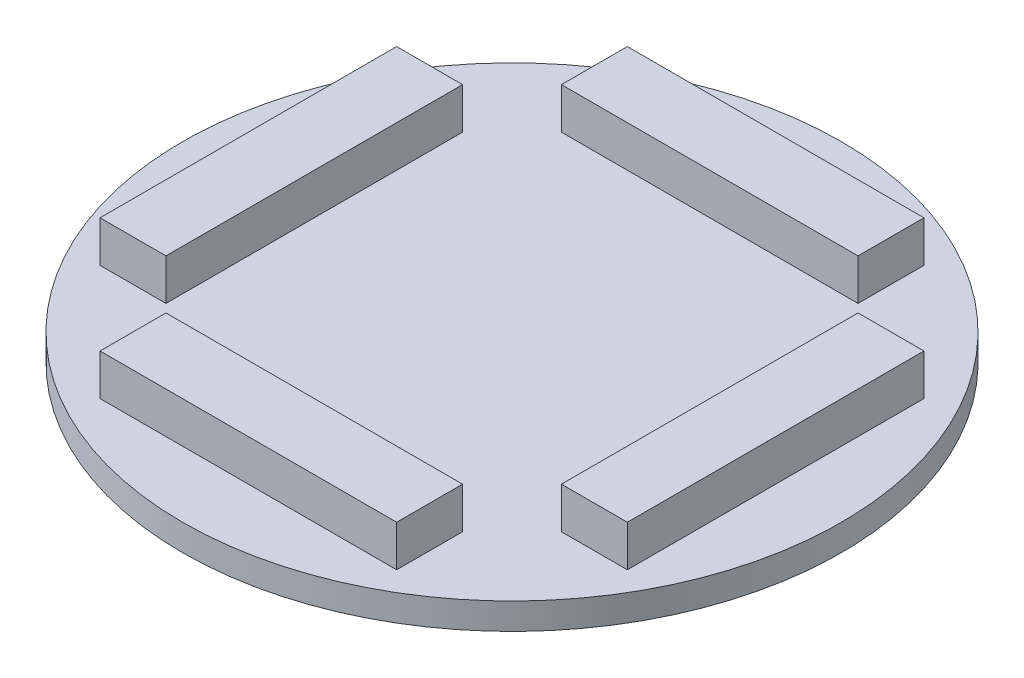
ISO-10303-21;
HEADER;
FILE_DESCRIPTION(('STEP AP214'),'2;1');
FILE_NAME('part.step','',(''),(''),'','','');
FILE_SCHEMA(('AUTOMOTIVE_DESIGN { 1 0 10303 214 1 1 1 1 }'));
ENDSEC;
DATA;
#1=APPLICATION_CONTEXT('core data for automotive mechanical design processes');
#2=APPLICATION_PROTOCOL_DEFINITION('international standard','automotive_design',2000,#1);
#3=PRODUCT_CONTEXT('',#1,'mechanical');
#4=PRODUCT('Part','Part','',(#3));
#5=PRODUCT_RELATED_PRODUCT_CATEGORY('part','',(#4));
#6=PRODUCT_DEFINITION_FORMATION('','',#4);
#7=PRODUCT_DEFINITION_CONTEXT('part definition',#1,'design');
#8=PRODUCT_DEFINITION('design','',#6,#7);
#9=PRODUCT_DEFINITION_SHAPE('','',#8);
#10=(LENGTH_UNIT() NAMED_UNIT(*) SI_UNIT(.MILLI.,.METRE.));
#11=(NAMED_UNIT(*) PLANE_ANGLE_UNIT() SI_UNIT($,.RADIAN.));
#12=(NAMED_UNIT(*) SI_UNIT($,.STERADIAN.) SOLID_ANGLE_UNIT());
#13=UNCERTAINTY_MEASURE_WITH_UNIT(LENGTH_MEASURE(1.E-05),#10,'distance_accuracy_value','');
#14=(GEOMETRIC_REPRESENTATION_CONTEXT(3) GLOBAL_UNCERTAINTY_ASSIGNED_CONTEXT((#13)) GLOBAL_UNIT_ASSIGNED_CONTEXT((#10,
#11,#12)) REPRESENTATION_CONTEXT('',''));
#15=CARTESIAN_POINT('',(0.,0.,0.));
#16=DIRECTION('',(0.,0.,1.));
#17=DIRECTION('',(1.,0.,0.));
#18=AXIS2_PLACEMENT_3D('',#15,#16,#17);
#19=CARTESIAN_POINT('',(0.,1.6,0.));
#20=DIRECTION('',(0.,1.,0.));
#21=DIRECTION('',(0.,0.,1.));
#22=AXIS2_PLACEMENT_3D('',#19,#20,#21);
#23=PLANE('',#22);
#24=CARTESIAN_POINT('',(0.,1.6,0.));
#25=DIRECTION('',(0.,1.,0.));
#26=DIRECTION('',(0.,0.,1.));
#27=AXIS2_PLACEMENT_3D('',#24,#25,#26);
#28=CIRCLE('',#27,20.);
#29=CARTESIAN_POINT('',(0.,1.6,20.));
#30=VERTEX_POINT('',#29);
#31=EDGE_CURVE('E11',#30,#30,#28,.T.);
#32=ORIENTED_EDGE('',*,*,#31,.T.);
#33=EDGE_LOOP('',(#32));
#34=FACE_BOUND('',#33,.T.);
#35=DIRECTION('',(1.,0.,0.));
#36=VECTOR('',#35,1.);
#37=CARTESIAN_POINT('',(-9.,1.6,-12.));
#38=LINE('',#37,#36);
#39=CARTESIAN_POINT('',(-9.,1.6,-12.));
#40=VERTEX_POINT('',#39);
#41=CARTESIAN_POINT('',(9.,1.6,-12.));
#42=VERTEX_POINT('',#41);
#43=EDGE_CURVE('E257',#40,#42,#38,.T.);
#44=ORIENTED_EDGE('',*,*,#43,.F.);
#45=DIRECTION('',(0.,0.,1.));
#46=VECTOR('',#45,1.);
#47=CARTESIAN_POINT('',(-9.,1.6,-16.));
#48=LINE('',#47,#46);
#49=CARTESIAN_POINT('',(-9.,1.6,-16.));
#50=VERTEX_POINT('',#49);
#51=EDGE_CURVE('E241',#50,#40,#48,.T.);
#52=ORIENTED_EDGE('',*,*,#51,.F.);
#53=DIRECTION('',(1.,0.,0.));
#54=VECTOR('',#53,1.);
#55=CARTESIAN_POINT('',(-9.,1.6,-16.));
#56=LINE('',#55,#54);
#57=CARTESIAN_POINT('',(9.,1.6,-16.));
#58=VERTEX_POINT('',#57);
#59=EDGE_CURVE('E246',#50,#58,#56,.T.);
#60=ORIENTED_EDGE('',*,*,#59,.T.);
#61=DIRECTION('',(0.,0.,1.));
#62=VECTOR('',#61,1.);
#63=CARTESIAN_POINT('',(9.,1.6,-16.));
#64=LINE('',#63,#62);
#65=EDGE_CURVE('E260',#58,#42,#64,.T.);
#66=ORIENTED_EDGE('',*,*,#65,.T.);
#67=EDGE_LOOP('',(#44,#52,#60,#66));
#68=FACE_BOUND('',#67,.T.);
#69=DIRECTION('',(0.,0.,-1.));
#70=VECTOR('',#69,1.);
#71=CARTESIAN_POINT('',(-12.,1.6,9.00000000000004));
#72=LINE('',#71,#70);
#73=CARTESIAN_POINT('',(-12.,1.6,9.00000000000004));
#74=VERTEX_POINT('',#73);
#75=CARTESIAN_POINT('',(-12.,1.6,-8.99999999999996));
#76=VERTEX_POINT('',#75);
#77=EDGE_CURVE('E224',#74,#76,#72,.T.);
#78=ORIENTED_EDGE('',*,*,#77,.F.);
#79=DIRECTION('',(1.,0.,0.));
#80=VECTOR('',#79,1.);
#81=CARTESIAN_POINT('',(-16.,1.6,9.00000000000006));
#82=LINE('',#81,#80);
#83=CARTESIAN_POINT('',(-16.,1.6,9.00000000000006));
#84=VERTEX_POINT('',#83);
#85=EDGE_CURVE('E208',#84,#74,#82,.T.);
#86=ORIENTED_EDGE('',*,*,#85,.F.);
#87=DIRECTION('',(0.,0.,-1.));
#88=VECTOR('',#87,1.);
#89=CARTESIAN_POINT('',(-16.,1.6,9.00000000000006));
#90=LINE('',#89,#88);
#91=CARTESIAN_POINT('',(-16.,1.6,-8.99999999999994));
#92=VERTEX_POINT('',#91);
#93=EDGE_CURVE('E213',#84,#92,#90,.T.);
#94=ORIENTED_EDGE('',*,*,#93,.T.);
#95=DIRECTION('',(1.,0.,0.));
#96=VECTOR('',#95,1.);
#97=CARTESIAN_POINT('',(-16.,1.6,-8.99999999999994));
#98=LINE('',#97,#96);
#99=EDGE_CURVE('E227',#92,#76,#98,.T.);
#100=ORIENTED_EDGE('',*,*,#99,.T.);
#101=EDGE_LOOP('',(#78,#86,#94,#100));
#102=FACE_BOUND('',#101,.T.);
#103=DIRECTION('',(-1.,0.,0.));
#104=VECTOR('',#103,1.);
#105=CARTESIAN_POINT('',(9.,1.6,12.));
#106=LINE('',#105,#104);
#107=CARTESIAN_POINT('',(9.,1.6,12.));
#108=VERTEX_POINT('',#107);
#109=CARTESIAN_POINT('',(-9.,1.6,12.));
#110=VERTEX_POINT('',#109);
#111=EDGE_CURVE('E173',#108,#110,#106,.T.);
#112=ORIENTED_EDGE('',*,*,#111,.F.);
#113=DIRECTION('',(0.,0.,-1.));
#114=VECTOR('',#113,1.);
#115=CARTESIAN_POINT('',(9.,1.6,16.));
#116=LINE('',#115,#114);
#117=CARTESIAN_POINT('',(9.,1.6,16.));
#118=VERTEX_POINT('',#117);
#119=EDGE_CURVE('E170',#118,#108,#116,.T.);
#120=ORIENTED_EDGE('',*,*,#119,.F.);
#121=DIRECTION('',(-1.,0.,0.));
#122=VECTOR('',#121,1.);
#123=CARTESIAN_POINT('',(9.,1.6,16.));
#124=LINE('',#123,#122);
#125=CARTESIAN_POINT('',(-9.,1.6,16.));
#126=VERTEX_POINT('',#125);
#127=EDGE_CURVE('E183',#118,#126,#124,.T.);
#128=ORIENTED_EDGE('',*,*,#127,.T.);
#129=DIRECTION('',(0.,0.,-1.));
#130=VECTOR('',#129,1.);
#131=CARTESIAN_POINT('',(-9.,1.6,16.));
#132=LINE('',#131,#130);
#133=EDGE_CURVE('E194',#126,#110,#132,.T.);
#134=ORIENTED_EDGE('',*,*,#133,.T.);
#135=EDGE_LOOP('',(#112,#120,#128,#134));
#136=FACE_BOUND('',#135,.T.);
#137=DIRECTION('',(0.,0.,1.));
#138=VECTOR('',#137,1.);
#139=CARTESIAN_POINT('',(11.9999999999999,1.6,-9.00000000000012));
#140=LINE('',#139,#138);
#141=CARTESIAN_POINT('',(11.9999999999999,1.6,-9.00000000000012));
#142=VERTEX_POINT('',#141);
#143=CARTESIAN_POINT('',(12.0000000000001,1.6,8.99999999999988));
#144=VERTEX_POINT('',#143);
#145=EDGE_CURVE('E50',#142,#144,#140,.T.);
#146=ORIENTED_EDGE('',*,*,#145,.F.);
#147=DIRECTION('',(-1.,0.,0.));
#148=VECTOR('',#147,1.);
#149=CARTESIAN_POINT('',(15.9999999999999,1.6,-9.00000000000017));
#150=LINE('',#149,#148);
#151=CARTESIAN_POINT('',(15.9999999999999,1.6,-9.00000000000017));
#152=VERTEX_POINT('',#151);
#153=EDGE_CURVE('E169',#152,#142,#150,.T.);
#154=ORIENTED_EDGE('',*,*,#153,.F.);
#155=DIRECTION('',(0.,0.,1.));
#156=VECTOR('',#155,1.);
#157=CARTESIAN_POINT('',(15.9999999999999,1.6,-9.00000000000017));
#158=LINE('',#157,#156);
#159=CARTESIAN_POINT('',(16.0000000000001,1.6,8.99999999999983));
#160=VERTEX_POINT('',#159);
#161=EDGE_CURVE('E166',#152,#160,#158,.T.);
#162=ORIENTED_EDGE('',*,*,#161,.T.);
#163=DIRECTION('',(-1.,0.,0.));
#164=VECTOR('',#163,1.);
#165=CARTESIAN_POINT('',(16.0000000000001,1.6,8.99999999999983));
#166=LINE('',#165,#164);
#167=EDGE_CURVE('E55',#160,#144,#166,.T.);
#168=ORIENTED_EDGE('',*,*,#167,.T.);
#169=EDGE_LOOP('',(#146,#154,#162,#168));
#170=FACE_BOUND('',#169,.T.);
#171=ADVANCED_FACE('F35',(#34,#68,#102,#136,#170),#23,.T.);
#172=CARTESIAN_POINT('',(0.,1.6,0.));
#173=DIRECTION('',(0.,-1.,0.));
#174=DIRECTION('',(0.,0.,-1.));
#175=AXIS2_PLACEMENT_3D('',#172,#173,#174);
#176=CYLINDRICAL_SURFACE('',#175,20.);
#177=ORIENTED_EDGE('',*,*,#31,.F.);
#178=EDGE_LOOP('',(#177));
#179=FACE_BOUND('',#178,.T.);
#180=CARTESIAN_POINT('',(0.,0.,0.));
#181=DIRECTION('',(0.,1.,0.));
#182=DIRECTION('',(0.,0.,1.));
#183=AXIS2_PLACEMENT_3D('',#180,#181,#182);
#184=CIRCLE('',#183,20.);
#185=CARTESIAN_POINT('',(0.,0.,20.));
#186=VERTEX_POINT('',#185);
#187=EDGE_CURVE('E39',#186,#186,#184,.T.);
#188=ORIENTED_EDGE('',*,*,#187,.T.);
#189=EDGE_LOOP('',(#188));
#190=FACE_BOUND('',#189,.T.);
#191=ADVANCED_FACE('F37',(#179,#190),#176,.T.);
#192=CARTESIAN_POINT('',(0.,0.,0.));
#193=DIRECTION('',(0.,1.,0.));
#194=DIRECTION('',(0.,0.,1.));
#195=AXIS2_PLACEMENT_3D('',#192,#193,#194);
#196=PLANE('',#195);
#197=ORIENTED_EDGE('',*,*,#187,.F.);
#198=EDGE_LOOP('',(#197));
#199=FACE_BOUND('',#198,.T.);
#200=ADVANCED_FACE('F279',(#199),#196,.F.);
#201=CARTESIAN_POINT('',(-9.,4.1,-16.));
#202=DIRECTION('',(1.,0.,0.));
#203=DIRECTION('',(0.,0.,-1.));
#204=AXIS2_PLACEMENT_3D('',#201,#202,#203);
#205=PLANE('',#204);
#206=ORIENTED_EDGE('',*,*,#51,.T.);
#207=DIRECTION('',(0.,-1.,0.));
#208=VECTOR('',#207,1.);
#209=CARTESIAN_POINT('',(-9.,4.1,-12.));
#210=LINE('',#209,#208);
#211=CARTESIAN_POINT('',(-9.,4.1,-12.));
#212=VERTEX_POINT('',#211);
#213=EDGE_CURVE('E271',#212,#40,#210,.T.);
#214=ORIENTED_EDGE('',*,*,#213,.F.);
#215=DIRECTION('',(0.,0.,1.));
#216=VECTOR('',#215,1.);
#217=CARTESIAN_POINT('',(-9.,4.1,-16.));
#218=LINE('',#217,#216);
#219=CARTESIAN_POINT('',(-9.,4.1,-16.));
#220=VERTEX_POINT('',#219);
#221=EDGE_CURVE('E242',#220,#212,#218,.T.);
#222=ORIENTED_EDGE('',*,*,#221,.F.);
#223=DIRECTION('',(0.,-1.,0.));
#224=VECTOR('',#223,1.);
#225=CARTESIAN_POINT('',(-9.,4.1,-16.));
#226=LINE('',#225,#224);
#227=EDGE_CURVE('E254',#220,#50,#226,.T.);
#228=ORIENTED_EDGE('',*,*,#227,.T.);
#229=EDGE_LOOP('',(#206,#214,#222,#228));
#230=FACE_BOUND('',#229,.T.);
#231=ADVANCED_FACE('F281',(#230),#205,.F.);
#232=CARTESIAN_POINT('',(-9.,4.1,-12.));
#233=DIRECTION('',(0.,0.,-1.));
#234=DIRECTION('',(-1.,0.,0.));
#235=AXIS2_PLACEMENT_3D('',#232,#233,#234);
#236=PLANE('',#235);
#237=ORIENTED_EDGE('',*,*,#43,.T.);
#238=DIRECTION('',(0.,-1.,0.));
#239=VECTOR('',#238,1.);
#240=CARTESIAN_POINT('',(9.,4.1,-12.));
#241=LINE('',#240,#239);
#242=CARTESIAN_POINT('',(9.,4.1,-12.));
#243=VERTEX_POINT('',#242);
#244=EDGE_CURVE('E268',#243,#42,#241,.T.);
#245=ORIENTED_EDGE('',*,*,#244,.F.);
#246=DIRECTION('',(1.,0.,0.));
#247=VECTOR('',#246,1.);
#248=CARTESIAN_POINT('',(-9.,4.1,-12.));
#249=LINE('',#248,#247);
#250=EDGE_CURVE('E245',#212,#243,#249,.T.);
#251=ORIENTED_EDGE('',*,*,#250,.F.);
#252=ORIENTED_EDGE('',*,*,#213,.T.);
#253=EDGE_LOOP('',(#237,#245,#251,#252));
#254=FACE_BOUND('',#253,.T.);
#255=ADVANCED_FACE('F286',(#254),#236,.F.);
#256=CARTESIAN_POINT('',(9.,4.1,-16.));
#257=DIRECTION('',(1.,0.,0.));
#258=DIRECTION('',(0.,0.,-1.));
#259=AXIS2_PLACEMENT_3D('',#256,#257,#258);
#260=PLANE('',#259);
#261=ORIENTED_EDGE('',*,*,#65,.F.);
#262=DIRECTION('',(0.,-1.,0.));
#263=VECTOR('',#262,1.);
#264=CARTESIAN_POINT('',(9.,4.1,-16.));
#265=LINE('',#264,#263);
#266=CARTESIAN_POINT('',(9.,4.1,-16.));
#267=VERTEX_POINT('',#266);
#268=EDGE_CURVE('E265',#267,#58,#265,.T.);
#269=ORIENTED_EDGE('',*,*,#268,.F.);
#270=DIRECTION('',(0.,0.,1.));
#271=VECTOR('',#270,1.);
#272=CARTESIAN_POINT('',(9.,4.1,-16.));
#273=LINE('',#272,#271);
#274=EDGE_CURVE('E248',#267,#243,#273,.T.);
#275=ORIENTED_EDGE('',*,*,#274,.T.);
#276=ORIENTED_EDGE('',*,*,#244,.T.);
#277=EDGE_LOOP('',(#261,#269,#275,#276));
#278=FACE_BOUND('',#277,.T.);
#279=ADVANCED_FACE('F299',(#278),#260,.T.);
#280=CARTESIAN_POINT('',(-9.,4.1,-16.));
#281=DIRECTION('',(0.,0.,-1.));
#282=DIRECTION('',(-1.,0.,0.));
#283=AXIS2_PLACEMENT_3D('',#280,#281,#282);
#284=PLANE('',#283);
#285=ORIENTED_EDGE('',*,*,#59,.F.);
#286=ORIENTED_EDGE('',*,*,#227,.F.);
#287=DIRECTION('',(1.,0.,0.));
#288=VECTOR('',#287,1.);
#289=CARTESIAN_POINT('',(-9.,4.1,-16.));
#290=LINE('',#289,#288);
#291=EDGE_CURVE('E251',#220,#267,#290,.T.);
#292=ORIENTED_EDGE('',*,*,#291,.T.);
#293=ORIENTED_EDGE('',*,*,#268,.T.);
#294=EDGE_LOOP('',(#285,#286,#292,#293));
#295=FACE_BOUND('',#294,.T.);
#296=ADVANCED_FACE('F302',(#295),#284,.T.);
#297=CARTESIAN_POINT('',(0.,4.1,0.));
#298=DIRECTION('',(0.,1.,0.));
#299=DIRECTION('',(0.,0.,1.));
#300=AXIS2_PLACEMENT_3D('',#297,#298,#299);
#301=PLANE('',#300);
#302=ORIENTED_EDGE('',*,*,#221,.T.);
#303=ORIENTED_EDGE('',*,*,#250,.T.);
#304=ORIENTED_EDGE('',*,*,#274,.F.);
#305=ORIENTED_EDGE('',*,*,#291,.F.);
#306=EDGE_LOOP('',(#302,#303,#304,#305));
#307=FACE_BOUND('',#306,.T.);
#308=ADVANCED_FACE('F306',(#307),#301,.T.);
#309=CARTESIAN_POINT('',(-16.,4.1,9.00000000000006));
#310=DIRECTION('',(0.,0.,-1.));
#311=DIRECTION('',(-1.,0.,0.));
#312=AXIS2_PLACEMENT_3D('',#309,#310,#311);
#313=PLANE('',#312);
#314=ORIENTED_EDGE('',*,*,#85,.T.);
#315=DIRECTION('',(0.,-1.,0.));
#316=VECTOR('',#315,1.);
#317=CARTESIAN_POINT('',(-12.,4.1,9.00000000000004));
#318=LINE('',#317,#316);
#319=CARTESIAN_POINT('',(-12.,4.1,9.00000000000004));
#320=VERTEX_POINT('',#319);
#321=EDGE_CURVE('E238',#320,#74,#318,.T.);
#322=ORIENTED_EDGE('',*,*,#321,.F.);
#323=DIRECTION('',(1.,0.,0.));
#324=VECTOR('',#323,1.);
#325=CARTESIAN_POINT('',(-16.,4.1,9.00000000000006));
#326=LINE('',#325,#324);
#327=CARTESIAN_POINT('',(-16.,4.1,9.00000000000006));
#328=VERTEX_POINT('',#327);
#329=EDGE_CURVE('E209',#328,#320,#326,.T.);
#330=ORIENTED_EDGE('',*,*,#329,.F.);
#331=DIRECTION('',(0.,-1.,0.));
#332=VECTOR('',#331,1.);
#333=CARTESIAN_POINT('',(-16.,4.1,9.00000000000006));
#334=LINE('',#333,#332);
#335=EDGE_CURVE('E221',#328,#84,#334,.T.);
#336=ORIENTED_EDGE('',*,*,#335,.T.);
#337=EDGE_LOOP('',(#314,#322,#330,#336));
#338=FACE_BOUND('',#337,.T.);
#339=ADVANCED_FACE('F310',(#338),#313,.F.);
#340=CARTESIAN_POINT('',(-12.,4.1,9.00000000000004));
#341=DIRECTION('',(-1.,0.,0.));
#342=DIRECTION('',(0.,0.,1.));
#343=AXIS2_PLACEMENT_3D('',#340,#341,#342);
#344=PLANE('',#343);
#345=ORIENTED_EDGE('',*,*,#77,.T.);
#346=DIRECTION('',(0.,-1.,0.));
#347=VECTOR('',#346,1.);
#348=CARTESIAN_POINT('',(-12.,4.1,-8.99999999999996));
#349=LINE('',#348,#347);
#350=CARTESIAN_POINT('',(-12.,4.1,-8.99999999999996));
#351=VERTEX_POINT('',#350);
#352=EDGE_CURVE('E235',#351,#76,#349,.T.);
#353=ORIENTED_EDGE('',*,*,#352,.F.);
#354=DIRECTION('',(0.,0.,-1.));
#355=VECTOR('',#354,1.);
#356=CARTESIAN_POINT('',(-12.,4.1,9.00000000000004));
#357=LINE('',#356,#355);
#358=EDGE_CURVE('E212',#320,#351,#357,.T.);
#359=ORIENTED_EDGE('',*,*,#358,.F.);
#360=ORIENTED_EDGE('',*,*,#321,.T.);
#361=EDGE_LOOP('',(#345,#353,#359,#360));
#362=FACE_BOUND('',#361,.T.);
#363=ADVANCED_FACE('F314',(#362),#344,.F.);
#364=CARTESIAN_POINT('',(-16.,4.1,-8.99999999999994));
#365=DIRECTION('',(0.,0.,-1.));
#366=DIRECTION('',(-1.,0.,0.));
#367=AXIS2_PLACEMENT_3D('',#364,#365,#366);
#368=PLANE('',#367);
#369=ORIENTED_EDGE('',*,*,#99,.F.);
#370=DIRECTION('',(0.,-1.,0.));
#371=VECTOR('',#370,1.);
#372=CARTESIAN_POINT('',(-16.,4.1,-8.99999999999994));
#373=LINE('',#372,#371);
#374=CARTESIAN_POINT('',(-16.,4.1,-8.99999999999994));
#375=VERTEX_POINT('',#374);
#376=EDGE_CURVE('E232',#375,#92,#373,.T.);
#377=ORIENTED_EDGE('',*,*,#376,.F.);
#378=DIRECTION('',(1.,0.,0.));
#379=VECTOR('',#378,1.);
#380=CARTESIAN_POINT('',(-16.,4.1,-8.99999999999994));
#381=LINE('',#380,#379);
#382=EDGE_CURVE('E215',#375,#351,#381,.T.);
#383=ORIENTED_EDGE('',*,*,#382,.T.);
#384=ORIENTED_EDGE('',*,*,#352,.T.);
#385=EDGE_LOOP('',(#369,#377,#383,#384));
#386=FACE_BOUND('',#385,.T.);
#387=ADVANCED_FACE('F318',(#386),#368,.T.);
#388=CARTESIAN_POINT('',(-16.,4.1,9.00000000000006));
#389=DIRECTION('',(-1.,0.,0.));
#390=DIRECTION('',(0.,0.,1.));
#391=AXIS2_PLACEMENT_3D('',#388,#389,#390);
#392=PLANE('',#391);
#393=ORIENTED_EDGE('',*,*,#93,.F.);
#394=ORIENTED_EDGE('',*,*,#335,.F.);
#395=DIRECTION('',(0.,0.,-1.));
#396=VECTOR('',#395,1.);
#397=CARTESIAN_POINT('',(-16.,4.1,9.00000000000006));
#398=LINE('',#397,#396);
#399=EDGE_CURVE('E218',#328,#375,#398,.T.);
#400=ORIENTED_EDGE('',*,*,#399,.T.);
#401=ORIENTED_EDGE('',*,*,#376,.T.);
#402=EDGE_LOOP('',(#393,#394,#400,#401));
#403=FACE_BOUND('',#402,.T.);
#404=ADVANCED_FACE('F322',(#403),#392,.T.);
#405=CARTESIAN_POINT('',(0.,4.1,0.));
#406=DIRECTION('',(0.,1.,0.));
#407=DIRECTION('',(1.,0.,0.));
#408=AXIS2_PLACEMENT_3D('',#405,#406,#407);
#409=PLANE('',#408);
#410=ORIENTED_EDGE('',*,*,#329,.T.);
#411=ORIENTED_EDGE('',*,*,#358,.T.);
#412=ORIENTED_EDGE('',*,*,#382,.F.);
#413=ORIENTED_EDGE('',*,*,#399,.F.);
#414=EDGE_LOOP('',(#410,#411,#412,#413));
#415=FACE_BOUND('',#414,.T.);
#416=ADVANCED_FACE('F326',(#415),#409,.T.);
#417=CARTESIAN_POINT('',(9.,4.1,16.));
#418=DIRECTION('',(-1.,0.,0.));
#419=DIRECTION('',(0.,0.,1.));
#420=AXIS2_PLACEMENT_3D('',#417,#418,#419);
#421=PLANE('',#420);
#422=ORIENTED_EDGE('',*,*,#119,.T.);
#423=DIRECTION('',(0.,-1.,0.));
#424=VECTOR('',#423,1.);
#425=CARTESIAN_POINT('',(9.,4.1,12.));
#426=LINE('',#425,#424);
#427=CARTESIAN_POINT('',(9.,4.1,12.));
#428=VERTEX_POINT('',#427);
#429=EDGE_CURVE('E205',#428,#108,#426,.T.);
#430=ORIENTED_EDGE('',*,*,#429,.F.);
#431=DIRECTION('',(0.,0.,-1.));
#432=VECTOR('',#431,1.);
#433=CARTESIAN_POINT('',(9.,4.1,16.));
#434=LINE('',#433,#432);
#435=CARTESIAN_POINT('',(9.,4.1,16.));
#436=VERTEX_POINT('',#435);
#437=EDGE_CURVE('E179',#436,#428,#434,.T.);
#438=ORIENTED_EDGE('',*,*,#437,.F.);
#439=DIRECTION('',(0.,-1.,0.));
#440=VECTOR('',#439,1.);
#441=CARTESIAN_POINT('',(9.,4.1,16.));
#442=LINE('',#441,#440);
#443=EDGE_CURVE('E190',#436,#118,#442,.T.);
#444=ORIENTED_EDGE('',*,*,#443,.T.);
#445=EDGE_LOOP('',(#422,#430,#438,#444));
#446=FACE_BOUND('',#445,.T.);
#447=ADVANCED_FACE('F330',(#446),#421,.F.);
#448=CARTESIAN_POINT('',(9.,4.1,12.));
#449=DIRECTION('',(0.,0.,1.));
#450=DIRECTION('',(1.,0.,0.));
#451=AXIS2_PLACEMENT_3D('',#448,#449,#450);
#452=PLANE('',#451);
#453=ORIENTED_EDGE('',*,*,#111,.T.);
#454=DIRECTION('',(0.,-1.,0.));
#455=VECTOR('',#454,1.);
#456=CARTESIAN_POINT('',(-9.,4.1,12.));
#457=LINE('',#456,#455);
#458=CARTESIAN_POINT('',(-9.,4.1,12.));
#459=VERTEX_POINT('',#458);
#460=EDGE_CURVE('E202',#459,#110,#457,.T.);
#461=ORIENTED_EDGE('',*,*,#460,.F.);
#462=DIRECTION('',(-1.,0.,0.));
#463=VECTOR('',#462,1.);
#464=CARTESIAN_POINT('',(9.,4.1,12.));
#465=LINE('',#464,#463);
#466=EDGE_CURVE('E182',#428,#459,#465,.T.);
#467=ORIENTED_EDGE('',*,*,#466,.F.);
#468=ORIENTED_EDGE('',*,*,#429,.T.);
#469=EDGE_LOOP('',(#453,#461,#467,#468));
#470=FACE_BOUND('',#469,.T.);
#471=ADVANCED_FACE('F334',(#470),#452,.F.);
#472=CARTESIAN_POINT('',(-9.,4.1,16.));
#473=DIRECTION('',(-1.,0.,0.));
#474=DIRECTION('',(0.,0.,1.));
#475=AXIS2_PLACEMENT_3D('',#472,#473,#474);
#476=PLANE('',#475);
#477=ORIENTED_EDGE('',*,*,#133,.F.);
#478=DIRECTION('',(0.,-1.,0.));
#479=VECTOR('',#478,1.);
#480=CARTESIAN_POINT('',(-9.,4.1,16.));
#481=LINE('',#480,#479);
#482=CARTESIAN_POINT('',(-9.,4.1,16.));
#483=VERTEX_POINT('',#482);
#484=EDGE_CURVE('E199',#483,#126,#481,.T.);
#485=ORIENTED_EDGE('',*,*,#484,.F.);
#486=DIRECTION('',(0.,0.,-1.));
#487=VECTOR('',#486,1.);
#488=CARTESIAN_POINT('',(-9.,4.1,16.));
#489=LINE('',#488,#487);
#490=EDGE_CURVE('E185',#483,#459,#489,.T.);
#491=ORIENTED_EDGE('',*,*,#490,.T.);
#492=ORIENTED_EDGE('',*,*,#460,.T.);
#493=EDGE_LOOP('',(#477,#485,#491,#492));
#494=FACE_BOUND('',#493,.T.);
#495=ADVANCED_FACE('F338',(#494),#476,.T.);
#496=CARTESIAN_POINT('',(9.,4.1,16.));
#497=DIRECTION('',(0.,0.,1.));
#498=DIRECTION('',(1.,0.,0.));
#499=AXIS2_PLACEMENT_3D('',#496,#497,#498);
#500=PLANE('',#499);
#501=ORIENTED_EDGE('',*,*,#127,.F.);
#502=ORIENTED_EDGE('',*,*,#443,.F.);
#503=DIRECTION('',(-1.,0.,0.));
#504=VECTOR('',#503,1.);
#505=CARTESIAN_POINT('',(9.,4.1,16.));
#506=LINE('',#505,#504);
#507=EDGE_CURVE('E188',#436,#483,#506,.T.);
#508=ORIENTED_EDGE('',*,*,#507,.T.);
#509=ORIENTED_EDGE('',*,*,#484,.T.);
#510=EDGE_LOOP('',(#501,#502,#508,#509));
#511=FACE_BOUND('',#510,.T.);
#512=ADVANCED_FACE('F342',(#511),#500,.T.);
#513=CARTESIAN_POINT('',(0.,4.1,0.));
#514=DIRECTION('',(0.,1.,0.));
#515=DIRECTION('',(0.,0.,-1.));
#516=AXIS2_PLACEMENT_3D('',#513,#514,#515);
#517=PLANE('',#516);
#518=ORIENTED_EDGE('',*,*,#437,.T.);
#519=ORIENTED_EDGE('',*,*,#466,.T.);
#520=ORIENTED_EDGE('',*,*,#490,.F.);
#521=ORIENTED_EDGE('',*,*,#507,.F.);
#522=EDGE_LOOP('',(#518,#519,#520,#521));
#523=FACE_BOUND('',#522,.T.);
#524=ADVANCED_FACE('F346',(#523),#517,.T.);
#525=CARTESIAN_POINT('',(15.9999999999999,4.1,-9.00000000000017));
#526=DIRECTION('',(0.,0.,1.));
#527=DIRECTION('',(1.,0.,0.));
#528=AXIS2_PLACEMENT_3D('',#525,#526,#527);
#529=PLANE('',#528);
#530=ORIENTED_EDGE('',*,*,#153,.T.);
#531=DIRECTION('',(0.,-1.,0.));
#532=VECTOR('',#531,1.);
#533=CARTESIAN_POINT('',(11.9999999999999,4.1,-9.00000000000012));
#534=LINE('',#533,#532);
#535=CARTESIAN_POINT('',(11.9999999999999,4.1,-9.00000000000012));
#536=VERTEX_POINT('',#535);
#537=EDGE_CURVE('E150',#536,#142,#534,.T.);
#538=ORIENTED_EDGE('',*,*,#537,.F.);
#539=DIRECTION('',(-1.,0.,0.));
#540=VECTOR('',#539,1.);
#541=CARTESIAN_POINT('',(15.9999999999999,4.1,-9.00000000000017));
#542=LINE('',#541,#540);
#543=CARTESIAN_POINT('',(15.9999999999999,4.1,-9.00000000000017));
#544=VERTEX_POINT('',#543);
#545=EDGE_CURVE('E157',#544,#536,#542,.T.);
#546=ORIENTED_EDGE('',*,*,#545,.F.);
#547=DIRECTION('',(0.,-1.,0.));
#548=VECTOR('',#547,1.);
#549=CARTESIAN_POINT('',(15.9999999999999,4.1,-9.00000000000017));
#550=LINE('',#549,#548);
#551=EDGE_CURVE('E540',#544,#152,#550,.T.);
#552=ORIENTED_EDGE('',*,*,#551,.T.);
#553=EDGE_LOOP('',(#530,#538,#546,#552));
#554=FACE_BOUND('',#553,.T.);
#555=ADVANCED_FACE('F168',(#554),#529,.F.);
#556=CARTESIAN_POINT('',(11.9999999999999,4.1,-9.00000000000012));
#557=DIRECTION('',(1.,0.,0.));
#558=DIRECTION('',(0.,0.,-1.));
#559=AXIS2_PLACEMENT_3D('',#556,#557,#558);
#560=PLANE('',#559);
#561=ORIENTED_EDGE('',*,*,#145,.T.);
#562=DIRECTION('',(0.,-1.,0.));
#563=VECTOR('',#562,1.);
#564=CARTESIAN_POINT('',(12.0000000000001,4.1,8.99999999999988));
#565=LINE('',#564,#563);
#566=CARTESIAN_POINT('',(12.0000000000001,4.1,8.99999999999988));
#567=VERTEX_POINT('',#566);
#568=EDGE_CURVE('E152',#567,#144,#565,.T.);
#569=ORIENTED_EDGE('',*,*,#568,.F.);
#570=DIRECTION('',(0.,0.,1.));
#571=VECTOR('',#570,1.);
#572=CARTESIAN_POINT('',(11.9999999999999,4.1,-9.00000000000012));
#573=LINE('',#572,#571);
#574=EDGE_CURVE('E146',#536,#567,#573,.T.);
#575=ORIENTED_EDGE('',*,*,#574,.F.);
#576=ORIENTED_EDGE('',*,*,#537,.T.);
#577=EDGE_LOOP('',(#561,#569,#575,#576));
#578=FACE_BOUND('',#577,.T.);
#579=ADVANCED_FACE('F148',(#578),#560,.F.);
#580=CARTESIAN_POINT('',(16.0000000000001,4.1,8.99999999999983));
#581=DIRECTION('',(0.,0.,1.));
#582=DIRECTION('',(1.,0.,0.));
#583=AXIS2_PLACEMENT_3D('',#580,#581,#582);
#584=PLANE('',#583);
#585=ORIENTED_EDGE('',*,*,#167,.F.);
#586=DIRECTION('',(0.,-1.,0.));
#587=VECTOR('',#586,1.);
#588=CARTESIAN_POINT('',(16.0000000000001,4.1,8.99999999999983));
#589=LINE('',#588,#587);
#590=CARTESIAN_POINT('',(16.0000000000001,4.1,8.99999999999983));
#591=VERTEX_POINT('',#590);
#592=EDGE_CURVE('E175',#591,#160,#589,.T.);
#593=ORIENTED_EDGE('',*,*,#592,.F.);
#594=DIRECTION('',(-1.,0.,0.));
#595=VECTOR('',#594,1.);
#596=CARTESIAN_POINT('',(16.0000000000001,4.1,8.99999999999983));
#597=LINE('',#596,#595);
#598=EDGE_CURVE('E156',#591,#567,#597,.T.);
#599=ORIENTED_EDGE('',*,*,#598,.T.);
#600=ORIENTED_EDGE('',*,*,#568,.T.);
#601=EDGE_LOOP('',(#585,#593,#599,#600));
#602=FACE_BOUND('',#601,.T.);
#603=ADVANCED_FACE('F355',(#602),#584,.T.);
#604=CARTESIAN_POINT('',(15.9999999999999,4.1,-9.00000000000017));
#605=DIRECTION('',(1.,0.,0.));
#606=DIRECTION('',(0.,0.,-1.));
#607=AXIS2_PLACEMENT_3D('',#604,#605,#606);
#608=PLANE('',#607);
#609=ORIENTED_EDGE('',*,*,#161,.F.);
#610=ORIENTED_EDGE('',*,*,#551,.F.);
#611=DIRECTION('',(0.,0.,1.));
#612=VECTOR('',#611,1.);
#613=CARTESIAN_POINT('',(15.9999999999999,4.1,-9.00000000000017));
#614=LINE('',#613,#612);
#615=EDGE_CURVE('E163',#544,#591,#614,.T.);
#616=ORIENTED_EDGE('',*,*,#615,.T.);
#617=ORIENTED_EDGE('',*,*,#592,.T.);
#618=EDGE_LOOP('',(#609,#610,#616,#617));
#619=FACE_BOUND('',#618,.T.);
#620=ADVANCED_FACE('F358',(#619),#608,.T.);
#621=CARTESIAN_POINT('',(0.,4.1,0.));
#622=DIRECTION('',(0.,1.,0.));
#623=DIRECTION('',(-1.,0.,0.));
#624=AXIS2_PLACEMENT_3D('',#621,#622,#623);
#625=PLANE('',#624);
#626=ORIENTED_EDGE('',*,*,#545,.T.);
#627=ORIENTED_EDGE('',*,*,#574,.T.);
#628=ORIENTED_EDGE('',*,*,#598,.F.);
#629=ORIENTED_EDGE('',*,*,#615,.F.);
#630=EDGE_LOOP('',(#626,#627,#628,#629));
#631=FACE_BOUND('',#630,.T.);
#632=ADVANCED_FACE('F161',(#631),#625,.T.);
#633=CLOSED_SHELL('',(#171,#191,#200,#231,#255,#279,#296,#308,#339,#363,#387,#404,#416,#447,
#471,#495,#512,#524,#555,#579,#603,#620,#632));
#634=MANIFOLD_SOLID_BREP('B2',#633);
#635=ADVANCED_BREP_SHAPE_REPRESENTATION('',(#18,#634),#14);
#636=SHAPE_DEFINITION_REPRESENTATION(#9,#635);
ENDSEC;
END-ISO-10303-21;
